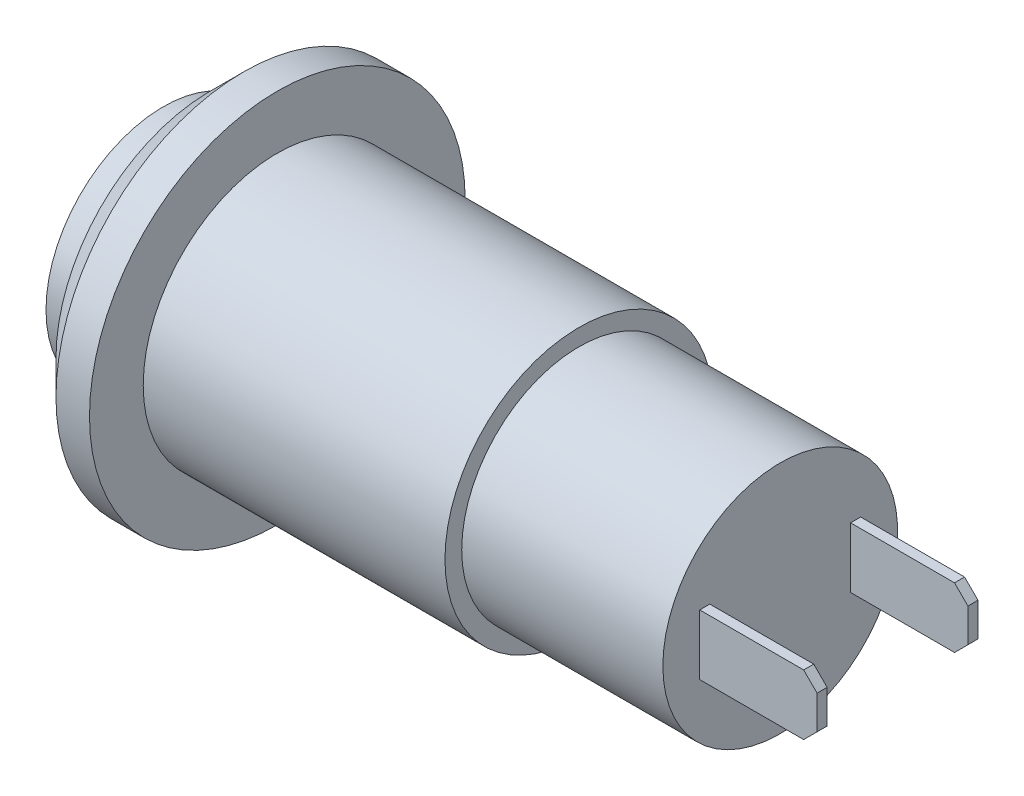
ISO-10303-21;
HEADER;
FILE_DESCRIPTION(('STEP AP214'),'2;1');
FILE_NAME('part.step','',(''),(''),'','','');
FILE_SCHEMA(('AUTOMOTIVE_DESIGN { 1 0 10303 214 1 1 1 1 }'));
ENDSEC;
DATA;
#1=APPLICATION_CONTEXT('core data for automotive mechanical design processes');
#2=APPLICATION_PROTOCOL_DEFINITION('international standard','automotive_design',2000,#1);
#3=PRODUCT_CONTEXT('',#1,'mechanical');
#4=PRODUCT('Part','Part','',(#3));
#5=PRODUCT_RELATED_PRODUCT_CATEGORY('part','',(#4));
#6=PRODUCT_DEFINITION_FORMATION('','',#4);
#7=PRODUCT_DEFINITION_CONTEXT('part definition',#1,'design');
#8=PRODUCT_DEFINITION('design','',#6,#7);
#9=PRODUCT_DEFINITION_SHAPE('','',#8);
#10=(LENGTH_UNIT() NAMED_UNIT(*) SI_UNIT(.MILLI.,.METRE.));
#11=(NAMED_UNIT(*) PLANE_ANGLE_UNIT() SI_UNIT($,.RADIAN.));
#12=(NAMED_UNIT(*) SI_UNIT($,.STERADIAN.) SOLID_ANGLE_UNIT());
#13=UNCERTAINTY_MEASURE_WITH_UNIT(LENGTH_MEASURE(1.E-05),#10,'distance_accuracy_value','');
#14=(GEOMETRIC_REPRESENTATION_CONTEXT(3) GLOBAL_UNCERTAINTY_ASSIGNED_CONTEXT((#13)) GLOBAL_UNIT_ASSIGNED_CONTEXT((#10,
#11,#12)) REPRESENTATION_CONTEXT('',''));
#15=CARTESIAN_POINT('',(0.,0.,0.));
#16=DIRECTION('',(0.,0.,1.));
#17=DIRECTION('',(1.,0.,0.));
#18=AXIS2_PLACEMENT_3D('',#15,#16,#17);
#19=CARTESIAN_POINT('',(18.4,-3.5,0.));
#20=DIRECTION('',(1.,0.,0.));
#21=DIRECTION('',(0.,0.,-1.));
#22=AXIS2_PLACEMENT_3D('',#19,#20,#21);
#23=PLANE('',#22);
#24=CARTESIAN_POINT('',(18.4,0.,0.));
#25=DIRECTION('',(-1.,0.,0.));
#26=DIRECTION('',(0.,0.,1.));
#27=AXIS2_PLACEMENT_3D('',#24,#25,#26);
#28=CIRCLE('',#27,3.5);
#29=CARTESIAN_POINT('',(18.4,0.,3.5));
#30=VERTEX_POINT('',#29);
#31=EDGE_CURVE('E209',#30,#30,#28,.T.);
#32=ORIENTED_EDGE('',*,*,#31,.F.);
#33=EDGE_LOOP('',(#32));
#34=FACE_BOUND('',#33,.T.);
#35=DIRECTION('',(0.,0.,-1.));
#36=VECTOR('',#35,1.);
#37=CARTESIAN_POINT('',(18.4,-0.900000000000004,2.1));
#38=LINE('',#37,#36);
#39=CARTESIAN_POINT('',(18.4,-0.900000000000004,2.4));
#40=VERTEX_POINT('',#39);
#41=CARTESIAN_POINT('',(18.4,-0.900000000000004,2.1));
#42=VERTEX_POINT('',#41);
#43=EDGE_CURVE('E187',#40,#42,#38,.T.);
#44=ORIENTED_EDGE('',*,*,#43,.F.);
#45=DIRECTION('',(0.,-1.,0.));
#46=VECTOR('',#45,1.);
#47=CARTESIAN_POINT('',(18.4,-0.900000000000004,2.4));
#48=LINE('',#47,#46);
#49=CARTESIAN_POINT('',(18.4,0.899999999999996,2.4));
#50=VERTEX_POINT('',#49);
#51=EDGE_CURVE('E142',#50,#40,#48,.T.);
#52=ORIENTED_EDGE('',*,*,#51,.F.);
#53=DIRECTION('',(0.,0.,1.));
#54=VECTOR('',#53,1.);
#55=CARTESIAN_POINT('',(18.4,0.899999999999996,2.1));
#56=LINE('',#55,#54);
#57=CARTESIAN_POINT('',(18.4,0.899999999999996,2.1));
#58=VERTEX_POINT('',#57);
#59=EDGE_CURVE('E179',#58,#50,#56,.T.);
#60=ORIENTED_EDGE('',*,*,#59,.F.);
#61=DIRECTION('',(0.,1.,0.));
#62=VECTOR('',#61,1.);
#63=CARTESIAN_POINT('',(18.4,-0.900000000000004,2.1));
#64=LINE('',#63,#62);
#65=EDGE_CURVE('E191',#42,#58,#64,.T.);
#66=ORIENTED_EDGE('',*,*,#65,.F.);
#67=EDGE_LOOP('',(#44,#52,#60,#66));
#68=FACE_BOUND('',#67,.T.);
#69=DIRECTION('',(0.,0.,-1.));
#70=VECTOR('',#69,1.);
#71=CARTESIAN_POINT('',(18.4,-0.900000000000004,-2.1));
#72=LINE('',#71,#70);
#73=CARTESIAN_POINT('',(18.4,-0.900000000000004,-2.1));
#74=VERTEX_POINT('',#73);
#75=CARTESIAN_POINT('',(18.4,-0.900000000000004,-2.4));
#76=VERTEX_POINT('',#75);
#77=EDGE_CURVE('E138',#74,#76,#72,.T.);
#78=ORIENTED_EDGE('',*,*,#77,.F.);
#79=DIRECTION('',(0.,-1.,0.));
#80=VECTOR('',#79,1.);
#81=CARTESIAN_POINT('',(18.4,-0.900000000000004,-2.1));
#82=LINE('',#81,#80);
#83=CARTESIAN_POINT('',(18.4,0.899999999999996,-2.1));
#84=VERTEX_POINT('',#83);
#85=EDGE_CURVE('E146',#84,#74,#82,.T.);
#86=ORIENTED_EDGE('',*,*,#85,.F.);
#87=DIRECTION('',(0.,0.,1.));
#88=VECTOR('',#87,1.);
#89=CARTESIAN_POINT('',(18.4,0.899999999999996,-2.1));
#90=LINE('',#89,#88);
#91=CARTESIAN_POINT('',(18.4,0.899999999999996,-2.4));
#92=VERTEX_POINT('',#91);
#93=EDGE_CURVE('E159',#92,#84,#90,.T.);
#94=ORIENTED_EDGE('',*,*,#93,.F.);
#95=DIRECTION('',(0.,1.,0.));
#96=VECTOR('',#95,1.);
#97=CARTESIAN_POINT('',(18.4,-0.900000000000004,-2.4));
#98=LINE('',#97,#96);
#99=EDGE_CURVE('E155',#76,#92,#98,.T.);
#100=ORIENTED_EDGE('',*,*,#99,.F.);
#101=EDGE_LOOP('',(#78,#86,#94,#100));
#102=FACE_BOUND('',#101,.T.);
#103=ADVANCED_FACE('F45',(#34,#68,#102),#23,.T.);
#104=CARTESIAN_POINT('',(0.,0.,0.));
#105=DIRECTION('',(-1.,0.,0.));
#106=DIRECTION('',(0.,0.,1.));
#107=AXIS2_PLACEMENT_3D('',#104,#105,#106);
#108=PLANE('',#107);
#109=CARTESIAN_POINT('',(0.,0.,0.));
#110=DIRECTION('',(-1.,0.,0.));
#111=DIRECTION('',(0.,0.,1.));
#112=AXIS2_PLACEMENT_3D('',#109,#110,#111);
#113=CIRCLE('',#112,3.5);
#114=CARTESIAN_POINT('',(0.,0.,3.5));
#115=VERTEX_POINT('',#114);
#116=EDGE_CURVE('E233',#115,#115,#113,.T.);
#117=ORIENTED_EDGE('',*,*,#116,.T.);
#118=EDGE_LOOP('',(#117));
#119=FACE_BOUND('',#118,.T.);
#120=ADVANCED_FACE('F319',(#119),#108,.T.);
#121=CARTESIAN_POINT('',(-3.0926965232654,0.,0.));
#122=DIRECTION('',(-1.,0.,0.));
#123=DIRECTION('',(0.,0.,1.));
#124=AXIS2_PLACEMENT_3D('',#121,#122,#123);
#125=CYLINDRICAL_SURFACE('',#124,3.5);
#126=CARTESIAN_POINT('',(1.4,0.,0.));
#127=DIRECTION('',(-1.,0.,0.));
#128=DIRECTION('',(0.,0.,1.));
#129=AXIS2_PLACEMENT_3D('',#126,#127,#128);
#130=CIRCLE('',#129,3.5);
#131=CARTESIAN_POINT('',(1.4,0.,3.5));
#132=VERTEX_POINT('',#131);
#133=EDGE_CURVE('E229',#132,#132,#130,.T.);
#134=ORIENTED_EDGE('',*,*,#133,.T.);
#135=EDGE_LOOP('',(#134));
#136=FACE_BOUND('',#135,.T.);
#137=ORIENTED_EDGE('',*,*,#116,.F.);
#138=EDGE_LOOP('',(#137));
#139=FACE_BOUND('',#138,.T.);
#140=ADVANCED_FACE('F325',(#136,#139),#125,.T.);
#141=CARTESIAN_POINT('',(1.4,-5.60259245013818,0.));
#142=DIRECTION('',(-1.,0.,0.));
#143=DIRECTION('',(0.,0.,1.));
#144=AXIS2_PLACEMENT_3D('',#141,#142,#143);
#145=PLANE('',#144);
#146=CARTESIAN_POINT('',(1.4,0.,0.));
#147=DIRECTION('',(-1.,0.,0.));
#148=DIRECTION('',(0.,0.,1.));
#149=AXIS2_PLACEMENT_3D('',#146,#147,#148);
#150=CIRCLE('',#149,4.60259245013819);
#151=CARTESIAN_POINT('',(1.4,0.,4.60259245013819));
#152=VERTEX_POINT('',#151);
#153=EDGE_CURVE('E237',#152,#152,#150,.T.);
#154=ORIENTED_EDGE('',*,*,#153,.T.);
#155=EDGE_LOOP('',(#154));
#156=FACE_BOUND('',#155,.T.);
#157=ORIENTED_EDGE('',*,*,#133,.F.);
#158=EDGE_LOOP('',(#157));
#159=FACE_BOUND('',#158,.T.);
#160=ADVANCED_FACE('F354',(#156,#159),#145,.T.);
#161=CARTESIAN_POINT('',(-3.0926965232654,0.,0.));
#162=DIRECTION('',(-1.,0.,0.));
#163=DIRECTION('',(0.,0.,1.));
#164=AXIS2_PLACEMENT_3D('',#161,#162,#163);
#165=CYLINDRICAL_SURFACE('',#164,5.60259245013818);
#166=CARTESIAN_POINT('',(2.4,0.,0.));
#167=DIRECTION('',(-1.,0.,0.));
#168=DIRECTION('',(0.,0.,1.));
#169=AXIS2_PLACEMENT_3D('',#166,#167,#168);
#170=CIRCLE('',#169,5.60259245013818);
#171=CARTESIAN_POINT('',(2.4,0.,5.60259245013818));
#172=VERTEX_POINT('',#171);
#173=EDGE_CURVE('E241',#172,#172,#170,.F.);
#174=ORIENTED_EDGE('',*,*,#173,.T.);
#175=EDGE_LOOP('',(#174));
#176=FACE_BOUND('',#175,.T.);
#177=CARTESIAN_POINT('',(3.4,0.,0.));
#178=DIRECTION('',(-1.,0.,0.));
#179=DIRECTION('',(0.,0.,1.));
#180=AXIS2_PLACEMENT_3D('',#177,#178,#179);
#181=CIRCLE('',#180,5.60259245013818);
#182=CARTESIAN_POINT('',(3.4,0.,5.60259245013818));
#183=VERTEX_POINT('',#182);
#184=EDGE_CURVE('E225',#183,#183,#181,.T.);
#185=ORIENTED_EDGE('',*,*,#184,.T.);
#186=EDGE_LOOP('',(#185));
#187=FACE_BOUND('',#186,.T.);
#188=ADVANCED_FACE('F350',(#176,#187),#165,.T.);
#189=CARTESIAN_POINT('',(3.4,-5.60259245013818,0.));
#190=DIRECTION('',(1.,0.,0.));
#191=DIRECTION('',(0.,0.,-1.));
#192=AXIS2_PLACEMENT_3D('',#189,#190,#191);
#193=PLANE('',#192);
#194=CARTESIAN_POINT('',(3.4,0.,0.));
#195=DIRECTION('',(-1.,0.,0.));
#196=DIRECTION('',(0.,0.,1.));
#197=AXIS2_PLACEMENT_3D('',#194,#195,#196);
#198=CIRCLE('',#197,4.);
#199=CARTESIAN_POINT('',(3.4,0.,4.));
#200=VERTEX_POINT('',#199);
#201=EDGE_CURVE('E221',#200,#200,#198,.T.);
#202=ORIENTED_EDGE('',*,*,#201,.T.);
#203=EDGE_LOOP('',(#202));
#204=FACE_BOUND('',#203,.T.);
#205=ORIENTED_EDGE('',*,*,#184,.F.);
#206=EDGE_LOOP('',(#205));
#207=FACE_BOUND('',#206,.T.);
#208=ADVANCED_FACE('F346',(#204,#207),#193,.T.);
#209=CARTESIAN_POINT('',(-3.0926965232654,0.,0.));
#210=DIRECTION('',(-1.,0.,0.));
#211=DIRECTION('',(0.,0.,1.));
#212=AXIS2_PLACEMENT_3D('',#209,#210,#211);
#213=CYLINDRICAL_SURFACE('',#212,4.);
#214=CARTESIAN_POINT('',(12.4,0.,0.));
#215=DIRECTION('',(-1.,0.,0.));
#216=DIRECTION('',(0.,0.,1.));
#217=AXIS2_PLACEMENT_3D('',#214,#215,#216);
#218=CIRCLE('',#217,4.);
#219=CARTESIAN_POINT('',(12.4,0.,4.));
#220=VERTEX_POINT('',#219);
#221=EDGE_CURVE('E217',#220,#220,#218,.T.);
#222=ORIENTED_EDGE('',*,*,#221,.T.);
#223=EDGE_LOOP('',(#222));
#224=FACE_BOUND('',#223,.T.);
#225=ORIENTED_EDGE('',*,*,#201,.F.);
#226=EDGE_LOOP('',(#225));
#227=FACE_BOUND('',#226,.T.);
#228=ADVANCED_FACE('F342',(#224,#227),#213,.T.);
#229=CARTESIAN_POINT('',(12.4,-4.,0.));
#230=DIRECTION('',(1.,0.,0.));
#231=DIRECTION('',(0.,0.,-1.));
#232=AXIS2_PLACEMENT_3D('',#229,#230,#231);
#233=PLANE('',#232);
#234=CARTESIAN_POINT('',(12.4,0.,0.));
#235=DIRECTION('',(-1.,0.,0.));
#236=DIRECTION('',(0.,0.,1.));
#237=AXIS2_PLACEMENT_3D('',#234,#235,#236);
#238=CIRCLE('',#237,3.5);
#239=CARTESIAN_POINT('',(12.4,0.,3.5));
#240=VERTEX_POINT('',#239);
#241=EDGE_CURVE('E213',#240,#240,#238,.T.);
#242=ORIENTED_EDGE('',*,*,#241,.T.);
#243=EDGE_LOOP('',(#242));
#244=FACE_BOUND('',#243,.T.);
#245=ORIENTED_EDGE('',*,*,#221,.F.);
#246=EDGE_LOOP('',(#245));
#247=FACE_BOUND('',#246,.T.);
#248=ADVANCED_FACE('F338',(#244,#247),#233,.T.);
#249=CARTESIAN_POINT('',(-3.0926965232654,0.,0.));
#250=DIRECTION('',(-1.,0.,0.));
#251=DIRECTION('',(0.,0.,1.));
#252=AXIS2_PLACEMENT_3D('',#249,#250,#251);
#253=CYLINDRICAL_SURFACE('',#252,3.5);
#254=ORIENTED_EDGE('',*,*,#31,.T.);
#255=EDGE_LOOP('',(#254));
#256=FACE_BOUND('',#255,.T.);
#257=ORIENTED_EDGE('',*,*,#241,.F.);
#258=EDGE_LOOP('',(#257));
#259=FACE_BOUND('',#258,.T.);
#260=ADVANCED_FACE('F334',(#256,#259),#253,.T.);
#261=CARTESIAN_POINT('',(1.4,0.,0.));
#262=DIRECTION('',(1.,0.,0.));
#263=DIRECTION('',(0.,0.,-1.));
#264=AXIS2_PLACEMENT_3D('',#261,#262,#263);
#265=CONICAL_SURFACE('',#264,4.60259245013819,0.785398163397447);
#266=ORIENTED_EDGE('',*,*,#173,.F.);
#267=EDGE_LOOP('',(#266));
#268=FACE_BOUND('',#267,.T.);
#269=ORIENTED_EDGE('',*,*,#153,.F.);
#270=EDGE_LOOP('',(#269));
#271=FACE_BOUND('',#270,.T.);
#272=ADVANCED_FACE('F337',(#268,#271),#265,.T.);
#273=CARTESIAN_POINT('',(21.9,-0.900000000000004,2.4));
#274=DIRECTION('',(0.,0.,-1.));
#275=DIRECTION('',(-1.,0.,0.));
#276=AXIS2_PLACEMENT_3D('',#273,#274,#275);
#277=PLANE('',#276);
#278=DIRECTION('',(0.,-1.,0.));
#279=VECTOR('',#278,1.);
#280=CARTESIAN_POINT('',(21.9,-0.900000000000004,2.4));
#281=LINE('',#280,#279);
#282=CARTESIAN_POINT('',(21.9,0.499999999999995,2.4));
#283=VERTEX_POINT('',#282);
#284=CARTESIAN_POINT('',(21.9,-0.5,2.4));
#285=VERTEX_POINT('',#284);
#286=EDGE_CURVE('E174',#283,#285,#281,.T.);
#287=ORIENTED_EDGE('',*,*,#286,.F.);
#288=DIRECTION('',(-0.707106781186548,0.707106781186548,0.));
#289=VECTOR('',#288,1.);
#290=CARTESIAN_POINT('',(21.9,0.499999999999996,2.4));
#291=LINE('',#290,#289);
#292=CARTESIAN_POINT('',(21.5,0.899999999999996,2.4));
#293=VERTEX_POINT('',#292);
#294=EDGE_CURVE('E256',#283,#293,#291,.T.);
#295=ORIENTED_EDGE('',*,*,#294,.T.);
#296=DIRECTION('',(-1.,0.,0.));
#297=VECTOR('',#296,1.);
#298=CARTESIAN_POINT('',(21.9,0.899999999999996,2.4));
#299=LINE('',#298,#297);
#300=EDGE_CURVE('E183',#293,#50,#299,.T.);
#301=ORIENTED_EDGE('',*,*,#300,.T.);
#302=ORIENTED_EDGE('',*,*,#51,.T.);
#303=DIRECTION('',(-1.,0.,0.));
#304=VECTOR('',#303,1.);
#305=CARTESIAN_POINT('',(21.9,-0.900000000000004,2.4));
#306=LINE('',#305,#304);
#307=CARTESIAN_POINT('',(21.5,-0.900000000000004,2.4));
#308=VERTEX_POINT('',#307);
#309=EDGE_CURVE('E206',#308,#40,#306,.T.);
#310=ORIENTED_EDGE('',*,*,#309,.F.);
#311=DIRECTION('',(0.707106781186548,0.707106781186548,0.));
#312=VECTOR('',#311,1.);
#313=CARTESIAN_POINT('',(21.9,-0.499999999999999,2.4));
#314=LINE('',#313,#312);
#315=EDGE_CURVE('E253',#308,#285,#314,.T.);
#316=ORIENTED_EDGE('',*,*,#315,.T.);
#317=EDGE_LOOP('',(#287,#295,#301,#302,#310,#316));
#318=FACE_BOUND('',#317,.T.);
#319=ADVANCED_FACE('F332',(#318),#277,.F.);
#320=CARTESIAN_POINT('',(21.9,-0.900000000000004,2.1));
#321=DIRECTION('',(0.,1.,0.));
#322=DIRECTION('',(0.,0.,1.));
#323=AXIS2_PLACEMENT_3D('',#320,#321,#322);
#324=PLANE('',#323);
#325=DIRECTION('',(-1.,0.,0.));
#326=VECTOR('',#325,1.);
#327=CARTESIAN_POINT('',(21.9,-0.900000000000004,2.1));
#328=LINE('',#327,#326);
#329=CARTESIAN_POINT('',(21.5,-0.900000000000004,2.1));
#330=VERTEX_POINT('',#329);
#331=EDGE_CURVE('E203',#330,#42,#328,.T.);
#332=ORIENTED_EDGE('',*,*,#331,.F.);
#333=DIRECTION('',(0.,0.,1.));
#334=VECTOR('',#333,1.);
#335=CARTESIAN_POINT('',(21.5,-0.900000000000004,2.4));
#336=LINE('',#335,#334);
#337=EDGE_CURVE('E268',#330,#308,#336,.T.);
#338=ORIENTED_EDGE('',*,*,#337,.T.);
#339=ORIENTED_EDGE('',*,*,#309,.T.);
#340=ORIENTED_EDGE('',*,*,#43,.T.);
#341=EDGE_LOOP('',(#332,#338,#339,#340));
#342=FACE_BOUND('',#341,.T.);
#343=ADVANCED_FACE('F467',(#342),#324,.F.);
#344=CARTESIAN_POINT('',(21.9,-0.900000000000004,2.1));
#345=DIRECTION('',(0.,0.,1.));
#346=DIRECTION('',(0.,-1.,0.));
#347=AXIS2_PLACEMENT_3D('',#344,#345,#346);
#348=PLANE('',#347);
#349=DIRECTION('',(-1.,0.,0.));
#350=VECTOR('',#349,1.);
#351=CARTESIAN_POINT('',(21.9,0.899999999999996,2.1));
#352=LINE('',#351,#350);
#353=CARTESIAN_POINT('',(21.5,0.899999999999996,2.1));
#354=VERTEX_POINT('',#353);
#355=EDGE_CURVE('E200',#354,#58,#352,.T.);
#356=ORIENTED_EDGE('',*,*,#355,.F.);
#357=DIRECTION('',(0.707106781186548,-0.707106781186548,0.));
#358=VECTOR('',#357,1.);
#359=CARTESIAN_POINT('',(21.9,0.499999999999995,2.1));
#360=LINE('',#359,#358);
#361=CARTESIAN_POINT('',(21.9,0.499999999999995,2.1));
#362=VERTEX_POINT('',#361);
#363=EDGE_CURVE('E265',#354,#362,#360,.T.);
#364=ORIENTED_EDGE('',*,*,#363,.T.);
#365=DIRECTION('',(0.,1.,0.));
#366=VECTOR('',#365,1.);
#367=CARTESIAN_POINT('',(21.9,-0.900000000000004,2.1));
#368=LINE('',#367,#366);
#369=CARTESIAN_POINT('',(21.9,-0.5,2.1));
#370=VERTEX_POINT('',#369);
#371=EDGE_CURVE('E178',#370,#362,#368,.T.);
#372=ORIENTED_EDGE('',*,*,#371,.F.);
#373=DIRECTION('',(-0.707106781186548,-0.707106781186548,0.));
#374=VECTOR('',#373,1.);
#375=CARTESIAN_POINT('',(21.9,-0.5,2.1));
#376=LINE('',#375,#374);
#377=EDGE_CURVE('E262',#370,#330,#376,.T.);
#378=ORIENTED_EDGE('',*,*,#377,.T.);
#379=ORIENTED_EDGE('',*,*,#331,.T.);
#380=ORIENTED_EDGE('',*,*,#65,.T.);
#381=EDGE_LOOP('',(#356,#364,#372,#378,#379,#380));
#382=FACE_BOUND('',#381,.T.);
#383=ADVANCED_FACE('F457',(#382),#348,.F.);
#384=CARTESIAN_POINT('',(21.9,0.899999999999996,2.1));
#385=DIRECTION('',(0.,-1.,0.));
#386=DIRECTION('',(0.,0.,-1.));
#387=AXIS2_PLACEMENT_3D('',#384,#385,#386);
#388=PLANE('',#387);
#389=ORIENTED_EDGE('',*,*,#300,.F.);
#390=DIRECTION('',(0.,0.,-1.));
#391=VECTOR('',#390,1.);
#392=CARTESIAN_POINT('',(21.5,0.899999999999996,2.1));
#393=LINE('',#392,#391);
#394=EDGE_CURVE('E259',#293,#354,#393,.T.);
#395=ORIENTED_EDGE('',*,*,#394,.T.);
#396=ORIENTED_EDGE('',*,*,#355,.T.);
#397=ORIENTED_EDGE('',*,*,#59,.T.);
#398=EDGE_LOOP('',(#389,#395,#396,#397));
#399=FACE_BOUND('',#398,.T.);
#400=ADVANCED_FACE('F447',(#399),#388,.F.);
#401=CARTESIAN_POINT('',(21.9,0.,0.));
#402=DIRECTION('',(1.,0.,0.));
#403=DIRECTION('',(0.,0.,-1.));
#404=AXIS2_PLACEMENT_3D('',#401,#402,#403);
#405=PLANE('',#404);
#406=ORIENTED_EDGE('',*,*,#371,.T.);
#407=DIRECTION('',(0.,0.,1.));
#408=VECTOR('',#407,1.);
#409=CARTESIAN_POINT('',(21.9,0.499999999999995,2.4));
#410=LINE('',#409,#408);
#411=EDGE_CURVE('E249',#362,#283,#410,.T.);
#412=ORIENTED_EDGE('',*,*,#411,.T.);
#413=ORIENTED_EDGE('',*,*,#286,.T.);
#414=DIRECTION('',(0.,0.,-1.));
#415=VECTOR('',#414,1.);
#416=CARTESIAN_POINT('',(21.9,-0.5,2.1));
#417=LINE('',#416,#415);
#418=EDGE_CURVE('E245',#285,#370,#417,.T.);
#419=ORIENTED_EDGE('',*,*,#418,.T.);
#420=EDGE_LOOP('',(#406,#412,#413,#419));
#421=FACE_BOUND('',#420,.T.);
#422=ADVANCED_FACE('F438',(#421),#405,.T.);
#423=CARTESIAN_POINT('',(21.9,-0.900000000000004,-2.1));
#424=DIRECTION('',(0.,0.,-1.));
#425=DIRECTION('',(0.,1.,0.));
#426=AXIS2_PLACEMENT_3D('',#423,#424,#425);
#427=PLANE('',#426);
#428=DIRECTION('',(-1.,0.,0.));
#429=VECTOR('',#428,1.);
#430=CARTESIAN_POINT('',(21.9,-0.900000000000004,-2.1));
#431=LINE('',#430,#429);
#432=CARTESIAN_POINT('',(21.5,-0.900000000000004,-2.1));
#433=VERTEX_POINT('',#432);
#434=EDGE_CURVE('E134',#433,#74,#431,.T.);
#435=ORIENTED_EDGE('',*,*,#434,.F.);
#436=DIRECTION('',(-0.707106781186548,-0.707106781186548,0.));
#437=VECTOR('',#436,1.);
#438=CARTESIAN_POINT('',(21.9,-0.5,-2.1));
#439=LINE('',#438,#437);
#440=CARTESIAN_POINT('',(21.9,-0.5,-2.1));
#441=VERTEX_POINT('',#440);
#442=EDGE_CURVE('E55',#433,#441,#439,.F.);
#443=ORIENTED_EDGE('',*,*,#442,.T.);
#444=DIRECTION('',(0.,-1.,0.));
#445=VECTOR('',#444,1.);
#446=CARTESIAN_POINT('',(21.9,-0.900000000000004,-2.1));
#447=LINE('',#446,#445);
#448=CARTESIAN_POINT('',(21.9,0.499999999999995,-2.1));
#449=VERTEX_POINT('',#448);
#450=EDGE_CURVE('E165',#449,#441,#447,.T.);
#451=ORIENTED_EDGE('',*,*,#450,.F.);
#452=DIRECTION('',(0.707106781186548,-0.707106781186548,0.));
#453=VECTOR('',#452,1.);
#454=CARTESIAN_POINT('',(21.9,0.499999999999995,-2.1));
#455=LINE('',#454,#453);
#456=CARTESIAN_POINT('',(21.5,0.899999999999996,-2.1));
#457=VERTEX_POINT('',#456);
#458=EDGE_CURVE('E62',#449,#457,#455,.F.);
#459=ORIENTED_EDGE('',*,*,#458,.T.);
#460=DIRECTION('',(-1.,0.,0.));
#461=VECTOR('',#460,1.);
#462=CARTESIAN_POINT('',(21.9,0.899999999999996,-2.1));
#463=LINE('',#462,#461);
#464=EDGE_CURVE('E148',#457,#84,#463,.T.);
#465=ORIENTED_EDGE('',*,*,#464,.T.);
#466=ORIENTED_EDGE('',*,*,#85,.T.);
#467=EDGE_LOOP('',(#435,#443,#451,#459,#465,#466));
#468=FACE_BOUND('',#467,.T.);
#469=ADVANCED_FACE('F147',(#468),#427,.F.);
#470=CARTESIAN_POINT('',(21.9,-0.900000000000004,-2.1));
#471=DIRECTION('',(0.,1.,0.));
#472=DIRECTION('',(0.,0.,1.));
#473=AXIS2_PLACEMENT_3D('',#470,#471,#472);
#474=PLANE('',#473);
#475=DIRECTION('',(-1.,0.,0.));
#476=VECTOR('',#475,1.);
#477=CARTESIAN_POINT('',(21.9,-0.900000000000004,-2.4));
#478=LINE('',#477,#476);
#479=CARTESIAN_POINT('',(21.5,-0.900000000000004,-2.4));
#480=VERTEX_POINT('',#479);
#481=EDGE_CURVE('E143',#480,#76,#478,.T.);
#482=ORIENTED_EDGE('',*,*,#481,.F.);
#483=DIRECTION('',(0.,0.,1.));
#484=VECTOR('',#483,1.);
#485=CARTESIAN_POINT('',(21.5,-0.900000000000004,-2.1));
#486=LINE('',#485,#484);
#487=EDGE_CURVE('E70',#480,#433,#486,.T.);
#488=ORIENTED_EDGE('',*,*,#487,.T.);
#489=ORIENTED_EDGE('',*,*,#434,.T.);
#490=ORIENTED_EDGE('',*,*,#77,.T.);
#491=EDGE_LOOP('',(#482,#488,#489,#490));
#492=FACE_BOUND('',#491,.T.);
#493=ADVANCED_FACE('F136',(#492),#474,.F.);
#494=CARTESIAN_POINT('',(21.9,-0.900000000000004,-2.4));
#495=DIRECTION('',(0.,0.,1.));
#496=DIRECTION('',(1.,0.,0.));
#497=AXIS2_PLACEMENT_3D('',#494,#495,#496);
#498=PLANE('',#497);
#499=DIRECTION('',(0.,1.,0.));
#500=VECTOR('',#499,1.);
#501=CARTESIAN_POINT('',(21.9,-0.900000000000004,-2.4));
#502=LINE('',#501,#500);
#503=CARTESIAN_POINT('',(21.9,-0.5,-2.4));
#504=VERTEX_POINT('',#503);
#505=CARTESIAN_POINT('',(21.9,0.499999999999995,-2.4));
#506=VERTEX_POINT('',#505);
#507=EDGE_CURVE('E169',#504,#506,#502,.T.);
#508=ORIENTED_EDGE('',*,*,#507,.F.);
#509=DIRECTION('',(0.707106781186548,0.707106781186548,0.));
#510=VECTOR('',#509,1.);
#511=CARTESIAN_POINT('',(21.9,-0.499999999999999,-2.4));
#512=LINE('',#511,#510);
#513=EDGE_CURVE('E282',#504,#480,#512,.F.);
#514=ORIENTED_EDGE('',*,*,#513,.T.);
#515=ORIENTED_EDGE('',*,*,#481,.T.);
#516=ORIENTED_EDGE('',*,*,#99,.T.);
#517=DIRECTION('',(-1.,0.,0.));
#518=VECTOR('',#517,1.);
#519=CARTESIAN_POINT('',(21.9,0.899999999999996,-2.4));
#520=LINE('',#519,#518);
#521=CARTESIAN_POINT('',(21.5,0.899999999999996,-2.4));
#522=VERTEX_POINT('',#521);
#523=EDGE_CURVE('E168',#522,#92,#520,.T.);
#524=ORIENTED_EDGE('',*,*,#523,.F.);
#525=DIRECTION('',(-0.707106781186548,0.707106781186548,0.));
#526=VECTOR('',#525,1.);
#527=CARTESIAN_POINT('',(21.9,0.499999999999996,-2.4));
#528=LINE('',#527,#526);
#529=EDGE_CURVE('E279',#522,#506,#528,.F.);
#530=ORIENTED_EDGE('',*,*,#529,.T.);
#531=EDGE_LOOP('',(#508,#514,#515,#516,#524,#530));
#532=FACE_BOUND('',#531,.T.);
#533=ADVANCED_FACE('F301',(#532),#498,.F.);
#534=CARTESIAN_POINT('',(21.9,0.899999999999996,-2.1));
#535=DIRECTION('',(0.,-1.,0.));
#536=DIRECTION('',(0.,0.,-1.));
#537=AXIS2_PLACEMENT_3D('',#534,#535,#536);
#538=PLANE('',#537);
#539=ORIENTED_EDGE('',*,*,#464,.F.);
#540=DIRECTION('',(0.,0.,-1.));
#541=VECTOR('',#540,1.);
#542=CARTESIAN_POINT('',(21.5,0.899999999999996,-2.1));
#543=LINE('',#542,#541);
#544=EDGE_CURVE('E11',#457,#522,#543,.T.);
#545=ORIENTED_EDGE('',*,*,#544,.T.);
#546=ORIENTED_EDGE('',*,*,#523,.T.);
#547=ORIENTED_EDGE('',*,*,#93,.T.);
#548=EDGE_LOOP('',(#539,#545,#546,#547));
#549=FACE_BOUND('',#548,.T.);
#550=ADVANCED_FACE('F308',(#549),#538,.F.);
#551=CARTESIAN_POINT('',(21.9,0.,0.));
#552=DIRECTION('',(-1.,0.,0.));
#553=DIRECTION('',(0.,0.,1.));
#554=AXIS2_PLACEMENT_3D('',#551,#552,#553);
#555=PLANE('',#554);
#556=ORIENTED_EDGE('',*,*,#450,.T.);
#557=DIRECTION('',(0.,0.,-1.));
#558=VECTOR('',#557,1.);
#559=CARTESIAN_POINT('',(21.9,-0.499999999999999,0.));
#560=LINE('',#559,#558);
#561=EDGE_CURVE('E275',#441,#504,#560,.T.);
#562=ORIENTED_EDGE('',*,*,#561,.T.);
#563=ORIENTED_EDGE('',*,*,#507,.T.);
#564=DIRECTION('',(0.,0.,1.));
#565=VECTOR('',#564,1.);
#566=CARTESIAN_POINT('',(21.9,0.499999999999997,0.));
#567=LINE('',#566,#565);
#568=EDGE_CURVE('E271',#506,#449,#567,.T.);
#569=ORIENTED_EDGE('',*,*,#568,.T.);
#570=EDGE_LOOP('',(#556,#562,#563,#569));
#571=FACE_BOUND('',#570,.T.);
#572=ADVANCED_FACE('F293',(#571),#555,.F.);
#573=CARTESIAN_POINT('',(21.9,0.499999999999997,0.));
#574=DIRECTION('',(0.707106781186547,0.707106781186547,0.));
#575=DIRECTION('',(0.,0.,-1.));
#576=AXIS2_PLACEMENT_3D('',#573,#574,#575);
#577=PLANE('',#576);
#578=ORIENTED_EDGE('',*,*,#363,.F.);
#579=ORIENTED_EDGE('',*,*,#394,.F.);
#580=ORIENTED_EDGE('',*,*,#294,.F.);
#581=ORIENTED_EDGE('',*,*,#411,.F.);
#582=EDGE_LOOP('',(#578,#579,#580,#581));
#583=FACE_BOUND('',#582,.T.);
#584=ADVANCED_FACE('F315',(#583),#577,.T.);
#585=CARTESIAN_POINT('',(21.9,-0.499999999999999,0.));
#586=DIRECTION('',(0.707106781186547,-0.707106781186547,0.));
#587=DIRECTION('',(0.,0.,1.));
#588=AXIS2_PLACEMENT_3D('',#585,#586,#587);
#589=PLANE('',#588);
#590=ORIENTED_EDGE('',*,*,#315,.F.);
#591=ORIENTED_EDGE('',*,*,#337,.F.);
#592=ORIENTED_EDGE('',*,*,#377,.F.);
#593=ORIENTED_EDGE('',*,*,#418,.F.);
#594=EDGE_LOOP('',(#590,#591,#592,#593));
#595=FACE_BOUND('',#594,.T.);
#596=ADVANCED_FACE('F374',(#595),#589,.T.);
#597=CARTESIAN_POINT('',(21.9,-0.499999999999999,0.));
#598=DIRECTION('',(-0.707106781186547,0.707106781186547,0.));
#599=DIRECTION('',(0.,0.,-1.));
#600=AXIS2_PLACEMENT_3D('',#597,#598,#599);
#601=PLANE('',#600);
#602=ORIENTED_EDGE('',*,*,#442,.F.);
#603=ORIENTED_EDGE('',*,*,#487,.F.);
#604=ORIENTED_EDGE('',*,*,#513,.F.);
#605=ORIENTED_EDGE('',*,*,#561,.F.);
#606=EDGE_LOOP('',(#602,#603,#604,#605));
#607=FACE_BOUND('',#606,.T.);
#608=ADVANCED_FACE('F299',(#607),#601,.F.);
#609=CARTESIAN_POINT('',(21.9,0.499999999999997,0.));
#610=DIRECTION('',(-0.707106781186547,-0.707106781186547,0.));
#611=DIRECTION('',(0.,0.,1.));
#612=AXIS2_PLACEMENT_3D('',#609,#610,#611);
#613=PLANE('',#612);
#614=ORIENTED_EDGE('',*,*,#529,.F.);
#615=ORIENTED_EDGE('',*,*,#544,.F.);
#616=ORIENTED_EDGE('',*,*,#458,.F.);
#617=ORIENTED_EDGE('',*,*,#568,.F.);
#618=EDGE_LOOP('',(#614,#615,#616,#617));
#619=FACE_BOUND('',#618,.T.);
#620=ADVANCED_FACE('F48',(#619),#613,.F.);
#621=CLOSED_SHELL('',(#103,#120,#140,#160,#188,#208,#228,#248,#260,#272,#319,#343,#383,#400,
#422,#469,#493,#533,#550,#572,#584,#596,#608,#620));
#622=MANIFOLD_SOLID_BREP('B2',#621);
#623=ADVANCED_BREP_SHAPE_REPRESENTATION('',(#18,#622),#14);
#624=SHAPE_DEFINITION_REPRESENTATION(#9,#623);
ENDSEC;
END-ISO-10303-21;
